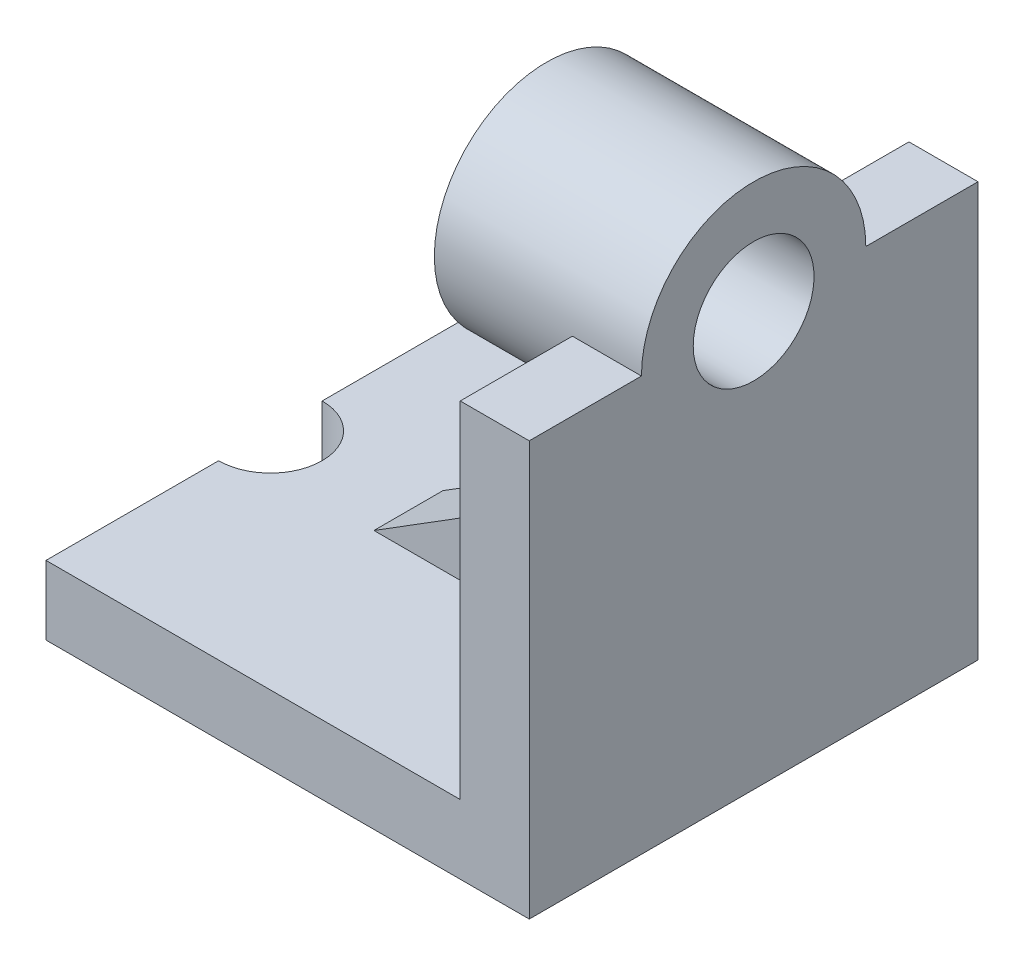
ISO-10303-21;
HEADER;
FILE_DESCRIPTION(('STEP AP214'),'2;1');
FILE_NAME('part.step','',(''),(''),'','','');
FILE_SCHEMA(('AUTOMOTIVE_DESIGN { 1 0 10303 214 1 1 1 1 }'));
ENDSEC;
DATA;
#1=APPLICATION_CONTEXT('core data for automotive mechanical design processes');
#2=APPLICATION_PROTOCOL_DEFINITION('international standard','automotive_design',2000,#1);
#3=PRODUCT_CONTEXT('',#1,'mechanical');
#4=PRODUCT('Part','Part','',(#3));
#5=PRODUCT_RELATED_PRODUCT_CATEGORY('part','',(#4));
#6=PRODUCT_DEFINITION_FORMATION('','',#4);
#7=PRODUCT_DEFINITION_CONTEXT('part definition',#1,'design');
#8=PRODUCT_DEFINITION('design','',#6,#7);
#9=PRODUCT_DEFINITION_SHAPE('','',#8);
#10=(LENGTH_UNIT() NAMED_UNIT(*) SI_UNIT(.MILLI.,.METRE.));
#11=(NAMED_UNIT(*) PLANE_ANGLE_UNIT() SI_UNIT($,.RADIAN.));
#12=(NAMED_UNIT(*) SI_UNIT($,.STERADIAN.) SOLID_ANGLE_UNIT());
#13=UNCERTAINTY_MEASURE_WITH_UNIT(LENGTH_MEASURE(1.E-05),#10,'distance_accuracy_value','');
#14=(GEOMETRIC_REPRESENTATION_CONTEXT(3) GLOBAL_UNCERTAINTY_ASSIGNED_CONTEXT((#13)) GLOBAL_UNIT_ASSIGNED_CONTEXT((#10,
#11,#12)) REPRESENTATION_CONTEXT('',''));
#15=CARTESIAN_POINT('',(0.,0.,0.));
#16=DIRECTION('',(0.,0.,1.));
#17=DIRECTION('',(1.,0.,0.));
#18=AXIS2_PLACEMENT_3D('',#15,#16,#17);
#19=CARTESIAN_POINT('',(-70.,0.,65.));
#20=DIRECTION('',(-1.,0.,0.));
#21=DIRECTION('',(0.,0.,1.));
#22=AXIS2_PLACEMENT_3D('',#19,#20,#21);
#23=PLANE('',#22);
#24=DIRECTION('',(0.,1.,0.));
#25=VECTOR('',#24,1.);
#26=CARTESIAN_POINT('',(-70.,-10.,15.));
#27=LINE('',#26,#25);
#28=CARTESIAN_POINT('',(-70.,-10.,15.));
#29=VERTEX_POINT('',#28);
#30=CARTESIAN_POINT('',(-70.,10.,15.));
#31=VERTEX_POINT('',#30);
#32=EDGE_CURVE('E86',#29,#31,#27,.T.);
#33=ORIENTED_EDGE('',*,*,#32,.F.);
#34=DIRECTION('',(0.,0.,-1.));
#35=VECTOR('',#34,1.);
#36=CARTESIAN_POINT('',(-70.,-10.,65.));
#37=LINE('',#36,#35);
#38=CARTESIAN_POINT('',(-70.,-10.,65.));
#39=VERTEX_POINT('',#38);
#40=EDGE_CURVE('E277',#39,#29,#37,.T.);
#41=ORIENTED_EDGE('',*,*,#40,.F.);
#42=DIRECTION('',(0.,1.,0.));
#43=VECTOR('',#42,1.);
#44=CARTESIAN_POINT('',(-70.,0.,65.));
#45=LINE('',#44,#43);
#46=CARTESIAN_POINT('',(-70.,10.,65.));
#47=VERTEX_POINT('',#46);
#48=EDGE_CURVE('E217',#39,#47,#45,.T.);
#49=ORIENTED_EDGE('',*,*,#48,.T.);
#50=DIRECTION('',(0.,0.,-1.));
#51=VECTOR('',#50,1.);
#52=CARTESIAN_POINT('',(-70.,10.,65.));
#53=LINE('',#52,#51);
#54=EDGE_CURVE('E272',#47,#31,#53,.T.);
#55=ORIENTED_EDGE('',*,*,#54,.T.);
#56=EDGE_LOOP('',(#33,#41,#49,#55));
#57=FACE_BOUND('',#56,.T.);
#58=ADVANCED_FACE('F61',(#57),#23,.T.);
#59=CARTESIAN_POINT('',(70.,110.,65.));
#60=DIRECTION('',(0.,-1.,0.));
#61=DIRECTION('',(1.,0.,0.));
#62=AXIS2_PLACEMENT_3D('',#59,#60,#61);
#63=PLANE('',#62);
#64=DIRECTION('',(0.,0.,-1.));
#65=VECTOR('',#64,1.);
#66=CARTESIAN_POINT('',(50.,110.,65.));
#67=LINE('',#66,#65);
#68=CARTESIAN_POINT('',(50.,110.,-32.5));
#69=VERTEX_POINT('',#68);
#70=CARTESIAN_POINT('',(50.,110.,-65.));
#71=VERTEX_POINT('',#70);
#72=EDGE_CURVE('E262',#69,#71,#67,.T.);
#73=ORIENTED_EDGE('',*,*,#72,.F.);
#74=DIRECTION('',(1.,0.,0.));
#75=VECTOR('',#74,1.);
#76=CARTESIAN_POINT('',(10.,110.,-32.5));
#77=LINE('',#76,#75);
#78=CARTESIAN_POINT('',(70.,110.,-32.5));
#79=VERTEX_POINT('',#78);
#80=EDGE_CURVE('E205',#69,#79,#77,.T.);
#81=ORIENTED_EDGE('',*,*,#80,.T.);
#82=DIRECTION('',(0.,0.,-1.));
#83=VECTOR('',#82,1.);
#84=CARTESIAN_POINT('',(70.,110.,65.));
#85=LINE('',#84,#83);
#86=CARTESIAN_POINT('',(70.,110.,-65.));
#87=VERTEX_POINT('',#86);
#88=EDGE_CURVE('E253',#79,#87,#85,.T.);
#89=ORIENTED_EDGE('',*,*,#88,.T.);
#90=DIRECTION('',(-1.,0.,0.));
#91=VECTOR('',#90,1.);
#92=CARTESIAN_POINT('',(70.,110.,-65.));
#93=LINE('',#92,#91);
#94=EDGE_CURVE('E238',#87,#71,#93,.T.);
#95=ORIENTED_EDGE('',*,*,#94,.T.);
#96=EDGE_LOOP('',(#73,#81,#89,#95));
#97=FACE_BOUND('',#96,.T.);
#98=ADVANCED_FACE('F312',(#97),#63,.F.);
#99=CARTESIAN_POINT('',(0.,-10.,65.));
#100=DIRECTION('',(0.,1.,0.));
#101=DIRECTION('',(0.,0.,1.));
#102=AXIS2_PLACEMENT_3D('',#99,#100,#101);
#103=PLANE('',#102);
#104=CARTESIAN_POINT('',(-70.,-10.,0.));
#105=DIRECTION('',(0.,1.,0.));
#106=DIRECTION('',(-1.,0.,0.));
#107=AXIS2_PLACEMENT_3D('',#104,#105,#106);
#108=CIRCLE('',#107,15.);
#109=CARTESIAN_POINT('',(-70.,-10.,-15.));
#110=VERTEX_POINT('',#109);
#111=EDGE_CURVE('E180',#29,#110,#108,.T.);
#112=ORIENTED_EDGE('',*,*,#111,.T.);
#113=CARTESIAN_POINT('',(-70.,-10.,-65.));
#114=VERTEX_POINT('',#113);
#115=EDGE_CURVE('E279',#110,#114,#37,.T.);
#116=ORIENTED_EDGE('',*,*,#115,.T.);
#117=DIRECTION('',(1.,0.,0.));
#118=VECTOR('',#117,1.);
#119=CARTESIAN_POINT('',(0.,-10.,-65.));
#120=LINE('',#119,#118);
#121=CARTESIAN_POINT('',(70.,-10.,-65.));
#122=VERTEX_POINT('',#121);
#123=EDGE_CURVE('E252',#114,#122,#120,.T.);
#124=ORIENTED_EDGE('',*,*,#123,.T.);
#125=DIRECTION('',(0.,0.,-1.));
#126=VECTOR('',#125,1.);
#127=CARTESIAN_POINT('',(70.,-10.,65.));
#128=LINE('',#127,#126);
#129=CARTESIAN_POINT('',(70.,-10.,65.));
#130=VERTEX_POINT('',#129);
#131=EDGE_CURVE('E287',#130,#122,#128,.T.);
#132=ORIENTED_EDGE('',*,*,#131,.F.);
#133=DIRECTION('',(1.,0.,0.));
#134=VECTOR('',#133,1.);
#135=CARTESIAN_POINT('',(0.,-10.,65.));
#136=LINE('',#135,#134);
#137=EDGE_CURVE('E208',#39,#130,#136,.T.);
#138=ORIENTED_EDGE('',*,*,#137,.F.);
#139=ORIENTED_EDGE('',*,*,#40,.T.);
#140=EDGE_LOOP('',(#112,#116,#124,#132,#138,#139));
#141=FACE_BOUND('',#140,.T.);
#142=ADVANCED_FACE('F300',(#141),#103,.F.);
#143=DIRECTION('',(0.,1.,0.));
#144=VECTOR('',#143,1.);
#145=CARTESIAN_POINT('',(-70.,-10.,-15.));
#146=LINE('',#145,#144);
#147=CARTESIAN_POINT('',(-70.,10.,-15.));
#148=VERTEX_POINT('',#147);
#149=EDGE_CURVE('E185',#148,#110,#146,.F.);
#150=ORIENTED_EDGE('',*,*,#149,.F.);
#151=CARTESIAN_POINT('',(-70.,10.,-65.));
#152=VERTEX_POINT('',#151);
#153=EDGE_CURVE('E284',#148,#152,#53,.T.);
#154=ORIENTED_EDGE('',*,*,#153,.T.);
#155=DIRECTION('',(0.,1.,0.));
#156=VECTOR('',#155,1.);
#157=CARTESIAN_POINT('',(-70.,0.,-65.));
#158=LINE('',#157,#156);
#159=EDGE_CURVE('E212',#114,#152,#158,.T.);
#160=ORIENTED_EDGE('',*,*,#159,.F.);
#161=ORIENTED_EDGE('',*,*,#115,.F.);
#162=EDGE_LOOP('',(#150,#154,#160,#161));
#163=FACE_BOUND('',#162,.T.);
#164=ADVANCED_FACE('F304',(#163),#23,.T.);
#165=CARTESIAN_POINT('',(0.,0.,-65.));
#166=DIRECTION('',(0.,0.,1.));
#167=DIRECTION('',(1.,0.,0.));
#168=AXIS2_PLACEMENT_3D('',#165,#166,#167);
#169=PLANE('',#168);
#170=ORIENTED_EDGE('',*,*,#123,.F.);
#171=ORIENTED_EDGE('',*,*,#159,.T.);
#172=DIRECTION('',(1.,0.,0.));
#173=VECTOR('',#172,1.);
#174=CARTESIAN_POINT('',(0.,10.,-65.));
#175=LINE('',#174,#173);
#176=CARTESIAN_POINT('',(50.,10.,-65.));
#177=VERTEX_POINT('',#176);
#178=EDGE_CURVE('E223',#152,#177,#175,.T.);
#179=ORIENTED_EDGE('',*,*,#178,.T.);
#180=DIRECTION('',(0.,1.,0.));
#181=VECTOR('',#180,1.);
#182=CARTESIAN_POINT('',(50.,10.,-65.));
#183=LINE('',#182,#181);
#184=EDGE_CURVE('E207',#177,#71,#183,.T.);
#185=ORIENTED_EDGE('',*,*,#184,.T.);
#186=ORIENTED_EDGE('',*,*,#94,.F.);
#187=DIRECTION('',(0.,1.,0.));
#188=VECTOR('',#187,1.);
#189=CARTESIAN_POINT('',(70.,0.,-65.));
#190=LINE('',#189,#188);
#191=EDGE_CURVE('E259',#122,#87,#190,.T.);
#192=ORIENTED_EDGE('',*,*,#191,.F.);
#193=EDGE_LOOP('',(#170,#171,#179,#185,#186,#192));
#194=FACE_BOUND('',#193,.T.);
#195=ADVANCED_FACE('F294',(#194),#169,.F.);
#196=CARTESIAN_POINT('',(0.,0.,65.));
#197=DIRECTION('',(0.,0.,1.));
#198=DIRECTION('',(1.,0.,0.));
#199=AXIS2_PLACEMENT_3D('',#196,#197,#198);
#200=PLANE('',#199);
#201=ORIENTED_EDGE('',*,*,#137,.T.);
#202=DIRECTION('',(0.,1.,0.));
#203=VECTOR('',#202,1.);
#204=CARTESIAN_POINT('',(70.,0.,65.));
#205=LINE('',#204,#203);
#206=CARTESIAN_POINT('',(70.,110.,65.));
#207=VERTEX_POINT('',#206);
#208=EDGE_CURVE('E211',#130,#207,#205,.T.);
#209=ORIENTED_EDGE('',*,*,#208,.T.);
#210=DIRECTION('',(-1.,0.,0.));
#211=VECTOR('',#210,1.);
#212=CARTESIAN_POINT('',(70.,110.,65.));
#213=LINE('',#212,#211);
#214=CARTESIAN_POINT('',(50.,110.,65.));
#215=VERTEX_POINT('',#214);
#216=EDGE_CURVE('E227',#207,#215,#213,.T.);
#217=ORIENTED_EDGE('',*,*,#216,.T.);
#218=DIRECTION('',(0.,1.,0.));
#219=VECTOR('',#218,1.);
#220=CARTESIAN_POINT('',(50.,10.,65.));
#221=LINE('',#220,#219);
#222=CARTESIAN_POINT('',(50.,10.,65.));
#223=VERTEX_POINT('',#222);
#224=EDGE_CURVE('E234',#223,#215,#221,.T.);
#225=ORIENTED_EDGE('',*,*,#224,.F.);
#226=DIRECTION('',(1.,0.,0.));
#227=VECTOR('',#226,1.);
#228=CARTESIAN_POINT('',(0.,10.,65.));
#229=LINE('',#228,#227);
#230=EDGE_CURVE('E214',#47,#223,#229,.T.);
#231=ORIENTED_EDGE('',*,*,#230,.F.);
#232=ORIENTED_EDGE('',*,*,#48,.F.);
#233=EDGE_LOOP('',(#201,#209,#217,#225,#231,#232));
#234=FACE_BOUND('',#233,.T.);
#235=ADVANCED_FACE('F267',(#234),#200,.T.);
#236=CARTESIAN_POINT('',(0.,10.,65.));
#237=DIRECTION('',(0.,1.,0.));
#238=DIRECTION('',(0.,0.,1.));
#239=AXIS2_PLACEMENT_3D('',#236,#237,#238);
#240=PLANE('',#239);
#241=DIRECTION('',(1.,0.,0.));
#242=VECTOR('',#241,1.);
#243=CARTESIAN_POINT('',(0.,10.,10.));
#244=LINE('',#243,#242);
#245=CARTESIAN_POINT('',(-30.,10.,10.));
#246=VERTEX_POINT('',#245);
#247=CARTESIAN_POINT('',(50.,10.,10.));
#248=VERTEX_POINT('',#247);
#249=EDGE_CURVE('E177',#246,#248,#244,.T.);
#250=ORIENTED_EDGE('',*,*,#249,.F.);
#251=DIRECTION('',(0.,0.,-1.));
#252=VECTOR('',#251,1.);
#253=CARTESIAN_POINT('',(-30.,10.,65.));
#254=LINE('',#253,#252);
#255=CARTESIAN_POINT('',(-30.,10.,-10.));
#256=VERTEX_POINT('',#255);
#257=EDGE_CURVE('E168',#256,#246,#254,.F.);
#258=ORIENTED_EDGE('',*,*,#257,.F.);
#259=DIRECTION('',(1.,0.,0.));
#260=VECTOR('',#259,1.);
#261=CARTESIAN_POINT('',(0.,10.,-9.99999999999999));
#262=LINE('',#261,#260);
#263=CARTESIAN_POINT('',(50.,10.,-9.99999999999999));
#264=VERTEX_POINT('',#263);
#265=EDGE_CURVE('E156',#256,#264,#262,.T.);
#266=ORIENTED_EDGE('',*,*,#265,.T.);
#267=DIRECTION('',(0.,0.,-1.));
#268=VECTOR('',#267,1.);
#269=CARTESIAN_POINT('',(50.,10.,65.));
#270=LINE('',#269,#268);
#271=EDGE_CURVE('E65',#264,#177,#270,.T.);
#272=ORIENTED_EDGE('',*,*,#271,.T.);
#273=ORIENTED_EDGE('',*,*,#178,.F.);
#274=ORIENTED_EDGE('',*,*,#153,.F.);
#275=CARTESIAN_POINT('',(-70.,10.,0.));
#276=DIRECTION('',(0.,1.,0.));
#277=DIRECTION('',(-1.,0.,0.));
#278=AXIS2_PLACEMENT_3D('',#275,#276,#277);
#279=CIRCLE('',#278,15.);
#280=EDGE_CURVE('E178',#31,#148,#279,.T.);
#281=ORIENTED_EDGE('',*,*,#280,.F.);
#282=ORIENTED_EDGE('',*,*,#54,.F.);
#283=ORIENTED_EDGE('',*,*,#230,.T.);
#284=EDGE_CURVE('E71',#223,#248,#270,.T.);
#285=ORIENTED_EDGE('',*,*,#284,.T.);
#286=EDGE_LOOP('',(#250,#258,#266,#272,#273,#274,#281,#282,#283,#285));
#287=FACE_BOUND('',#286,.T.);
#288=ADVANCED_FACE('F175',(#287),#240,.T.);
#289=CARTESIAN_POINT('',(70.,0.,65.));
#290=DIRECTION('',(-1.,0.,0.));
#291=DIRECTION('',(0.,0.,1.));
#292=AXIS2_PLACEMENT_3D('',#289,#290,#291);
#293=PLANE('',#292);
#294=CARTESIAN_POINT('',(70.,110.,0.));
#295=DIRECTION('',(-1.,0.,0.));
#296=DIRECTION('',(0.,0.,1.));
#297=AXIS2_PLACEMENT_3D('',#294,#295,#296);
#298=CIRCLE('',#297,17.5);
#299=CARTESIAN_POINT('',(70.,110.,17.5));
#300=VERTEX_POINT('',#299);
#301=EDGE_CURVE('E191',#300,#300,#298,.T.);
#302=ORIENTED_EDGE('',*,*,#301,.T.);
#303=EDGE_LOOP('',(#302));
#304=FACE_BOUND('',#303,.T.);
#305=ORIENTED_EDGE('',*,*,#131,.T.);
#306=ORIENTED_EDGE('',*,*,#191,.T.);
#307=ORIENTED_EDGE('',*,*,#88,.F.);
#308=CARTESIAN_POINT('',(70.,110.,0.));
#309=DIRECTION('',(1.,0.,0.));
#310=DIRECTION('',(0.,0.,-1.));
#311=AXIS2_PLACEMENT_3D('',#308,#309,#310);
#312=CIRCLE('',#311,32.5);
#313=CARTESIAN_POINT('',(70.,110.,32.5));
#314=VERTEX_POINT('',#313);
#315=EDGE_CURVE('E194',#79,#314,#312,.T.);
#316=ORIENTED_EDGE('',*,*,#315,.T.);
#317=EDGE_CURVE('E251',#207,#314,#85,.T.);
#318=ORIENTED_EDGE('',*,*,#317,.F.);
#319=ORIENTED_EDGE('',*,*,#208,.F.);
#320=EDGE_LOOP('',(#305,#306,#307,#316,#318,#319));
#321=FACE_BOUND('',#320,.T.);
#322=ADVANCED_FACE('F298',(#304,#321),#293,.F.);
#323=ORIENTED_EDGE('',*,*,#317,.T.);
#324=DIRECTION('',(1.,0.,0.));
#325=VECTOR('',#324,1.);
#326=CARTESIAN_POINT('',(10.,110.,32.5));
#327=LINE('',#326,#325);
#328=CARTESIAN_POINT('',(50.,110.,32.5));
#329=VERTEX_POINT('',#328);
#330=EDGE_CURVE('E200',#314,#329,#327,.F.);
#331=ORIENTED_EDGE('',*,*,#330,.T.);
#332=EDGE_CURVE('E232',#215,#329,#67,.T.);
#333=ORIENTED_EDGE('',*,*,#332,.F.);
#334=ORIENTED_EDGE('',*,*,#216,.F.);
#335=EDGE_LOOP('',(#323,#331,#333,#334));
#336=FACE_BOUND('',#335,.T.);
#337=ADVANCED_FACE('F269',(#336),#63,.F.);
#338=CARTESIAN_POINT('',(50.,10.,65.));
#339=DIRECTION('',(-1.,0.,0.));
#340=DIRECTION('',(0.,-1.,0.));
#341=AXIS2_PLACEMENT_3D('',#338,#339,#340);
#342=PLANE('',#341);
#343=DIRECTION('',(0.,1.,0.));
#344=VECTOR('',#343,1.);
#345=CARTESIAN_POINT('',(50.,10.,10.));
#346=LINE('',#345,#344);
#347=CARTESIAN_POINT('',(50.,60.,10.));
#348=VERTEX_POINT('',#347);
#349=EDGE_CURVE('E163',#248,#348,#346,.T.);
#350=ORIENTED_EDGE('',*,*,#349,.F.);
#351=ORIENTED_EDGE('',*,*,#284,.F.);
#352=ORIENTED_EDGE('',*,*,#224,.T.);
#353=ORIENTED_EDGE('',*,*,#332,.T.);
#354=CARTESIAN_POINT('',(50.,110.,0.));
#355=DIRECTION('',(-1.,0.,0.));
#356=DIRECTION('',(0.,-1.,0.));
#357=AXIS2_PLACEMENT_3D('',#354,#355,#356);
#358=CIRCLE('',#357,32.5);
#359=EDGE_CURVE('E12',#69,#329,#358,.T.);
#360=ORIENTED_EDGE('',*,*,#359,.F.);
#361=ORIENTED_EDGE('',*,*,#72,.T.);
#362=ORIENTED_EDGE('',*,*,#184,.F.);
#363=ORIENTED_EDGE('',*,*,#271,.F.);
#364=DIRECTION('',(0.,1.,0.));
#365=VECTOR('',#364,1.);
#366=CARTESIAN_POINT('',(50.,10.,-9.99999999999999));
#367=LINE('',#366,#365);
#368=CARTESIAN_POINT('',(50.,60.,-10.));
#369=VERTEX_POINT('',#368);
#370=EDGE_CURVE('E159',#264,#369,#367,.T.);
#371=ORIENTED_EDGE('',*,*,#370,.T.);
#372=DIRECTION('',(0.,0.,1.));
#373=VECTOR('',#372,1.);
#374=CARTESIAN_POINT('',(50.,60.,65.));
#375=LINE('',#374,#373);
#376=EDGE_CURVE('E171',#348,#369,#375,.F.);
#377=ORIENTED_EDGE('',*,*,#376,.F.);
#378=EDGE_LOOP('',(#350,#351,#352,#353,#360,#361,#362,#363,#371,#377));
#379=FACE_BOUND('',#378,.T.);
#380=ADVANCED_FACE('F63',(#379),#342,.T.);
#381=CARTESIAN_POINT('',(10.,110.,0.));
#382=DIRECTION('',(1.,0.,0.));
#383=DIRECTION('',(0.,0.,-1.));
#384=AXIS2_PLACEMENT_3D('',#381,#382,#383);
#385=CYLINDRICAL_SURFACE('',#384,32.5);
#386=CARTESIAN_POINT('',(10.,110.,0.));
#387=DIRECTION('',(1.,0.,0.));
#388=DIRECTION('',(0.,0.,-1.));
#389=AXIS2_PLACEMENT_3D('',#386,#387,#388);
#390=CIRCLE('',#389,32.5);
#391=CARTESIAN_POINT('',(10.,110.,-32.5));
#392=VERTEX_POINT('',#391);
#393=EDGE_CURVE('E197',#392,#392,#390,.T.);
#394=ORIENTED_EDGE('',*,*,#393,.T.);
#395=EDGE_LOOP('',(#394));
#396=FACE_BOUND('',#395,.T.);
#397=ORIENTED_EDGE('',*,*,#80,.F.);
#398=ORIENTED_EDGE('',*,*,#359,.T.);
#399=ORIENTED_EDGE('',*,*,#330,.F.);
#400=ORIENTED_EDGE('',*,*,#315,.F.);
#401=EDGE_LOOP('',(#397,#398,#399,#400));
#402=FACE_BOUND('',#401,.T.);
#403=ADVANCED_FACE('F326',(#396,#402),#385,.T.);
#404=CARTESIAN_POINT('',(10.,110.,0.));
#405=DIRECTION('',(1.,0.,0.));
#406=DIRECTION('',(0.,0.,-1.));
#407=AXIS2_PLACEMENT_3D('',#404,#405,#406);
#408=PLANE('',#407);
#409=CARTESIAN_POINT('',(10.,110.,0.));
#410=DIRECTION('',(-1.,0.,0.));
#411=DIRECTION('',(0.,0.,1.));
#412=AXIS2_PLACEMENT_3D('',#409,#410,#411);
#413=CIRCLE('',#412,17.5);
#414=CARTESIAN_POINT('',(10.,110.,17.5));
#415=VERTEX_POINT('',#414);
#416=EDGE_CURVE('E190',#415,#415,#413,.T.);
#417=ORIENTED_EDGE('',*,*,#416,.F.);
#418=EDGE_LOOP('',(#417));
#419=FACE_BOUND('',#418,.T.);
#420=ORIENTED_EDGE('',*,*,#393,.F.);
#421=EDGE_LOOP('',(#420));
#422=FACE_BOUND('',#421,.T.);
#423=ADVANCED_FACE('F337',(#419,#422),#408,.F.);
#424=CARTESIAN_POINT('',(70.,110.,0.));
#425=DIRECTION('',(-1.,0.,0.));
#426=DIRECTION('',(0.,0.,1.));
#427=AXIS2_PLACEMENT_3D('',#424,#425,#426);
#428=CYLINDRICAL_SURFACE('',#427,17.5);
#429=ORIENTED_EDGE('',*,*,#301,.F.);
#430=EDGE_LOOP('',(#429));
#431=FACE_BOUND('',#430,.T.);
#432=ORIENTED_EDGE('',*,*,#416,.T.);
#433=EDGE_LOOP('',(#432));
#434=FACE_BOUND('',#433,.T.);
#435=ADVANCED_FACE('F334',(#431,#434),#428,.F.);
#436=CARTESIAN_POINT('',(-70.,-10.,0.));
#437=DIRECTION('',(0.,1.,0.));
#438=DIRECTION('',(-1.,0.,0.));
#439=AXIS2_PLACEMENT_3D('',#436,#437,#438);
#440=CYLINDRICAL_SURFACE('',#439,15.);
#441=ORIENTED_EDGE('',*,*,#149,.T.);
#442=ORIENTED_EDGE('',*,*,#111,.F.);
#443=ORIENTED_EDGE('',*,*,#32,.T.);
#444=ORIENTED_EDGE('',*,*,#280,.T.);
#445=EDGE_LOOP('',(#441,#442,#443,#444));
#446=FACE_BOUND('',#445,.T.);
#447=ADVANCED_FACE('F302',(#446),#440,.F.);
#448=CARTESIAN_POINT('',(-30.,10.,0.));
#449=DIRECTION('',(0.52999894000318,-0.847998304005088,0.));
#450=DIRECTION('',(0.847998304005088,0.52999894000318,0.));
#451=AXIS2_PLACEMENT_3D('',#448,#449,#450);
#452=PLANE('',#451);
#453=DIRECTION('',(0.847998304005088,0.52999894000318,0.));
#454=VECTOR('',#453,1.);
#455=CARTESIAN_POINT('',(-30.,10.,-10.));
#456=LINE('',#455,#454);
#457=EDGE_CURVE('E78',#256,#369,#456,.T.);
#458=ORIENTED_EDGE('',*,*,#457,.F.);
#459=ORIENTED_EDGE('',*,*,#257,.T.);
#460=DIRECTION('',(0.847998304005088,0.52999894000318,0.));
#461=VECTOR('',#460,1.);
#462=CARTESIAN_POINT('',(-30.,10.,10.));
#463=LINE('',#462,#461);
#464=EDGE_CURVE('E172',#246,#348,#463,.T.);
#465=ORIENTED_EDGE('',*,*,#464,.T.);
#466=ORIENTED_EDGE('',*,*,#376,.T.);
#467=EDGE_LOOP('',(#458,#459,#465,#466));
#468=FACE_BOUND('',#467,.T.);
#469=ADVANCED_FACE('F166',(#468),#452,.F.);
#470=CARTESIAN_POINT('',(-1.25000000003594E-05,66.25,10.));
#471=DIRECTION('',(0.,0.,1.));
#472=DIRECTION('',(1.,0.,0.));
#473=AXIS2_PLACEMENT_3D('',#470,#471,#472);
#474=PLANE('',#473);
#475=ORIENTED_EDGE('',*,*,#464,.F.);
#476=ORIENTED_EDGE('',*,*,#249,.T.);
#477=ORIENTED_EDGE('',*,*,#349,.T.);
#478=EDGE_LOOP('',(#475,#476,#477));
#479=FACE_BOUND('',#478,.T.);
#480=ADVANCED_FACE('F399',(#479),#474,.T.);
#481=CARTESIAN_POINT('',(-1.25000000003594E-05,66.25,-10.));
#482=DIRECTION('',(0.,0.,1.));
#483=DIRECTION('',(1.,0.,0.));
#484=AXIS2_PLACEMENT_3D('',#481,#482,#483);
#485=PLANE('',#484);
#486=ORIENTED_EDGE('',*,*,#265,.F.);
#487=ORIENTED_EDGE('',*,*,#457,.T.);
#488=ORIENTED_EDGE('',*,*,#370,.F.);
#489=EDGE_LOOP('',(#486,#487,#488));
#490=FACE_BOUND('',#489,.T.);
#491=ADVANCED_FACE('F157',(#490),#485,.F.);
#492=CLOSED_SHELL('',(#58,#98,#142,#164,#195,#235,#288,#322,#337,#380,#403,#423,#435,#447,#469,
#480,#491));
#493=MANIFOLD_SOLID_BREP('B2',#492);
#494=ADVANCED_BREP_SHAPE_REPRESENTATION('',(#18,#493),#14);
#495=SHAPE_DEFINITION_REPRESENTATION(#9,#494);
ENDSEC;
END-ISO-10303-21;
